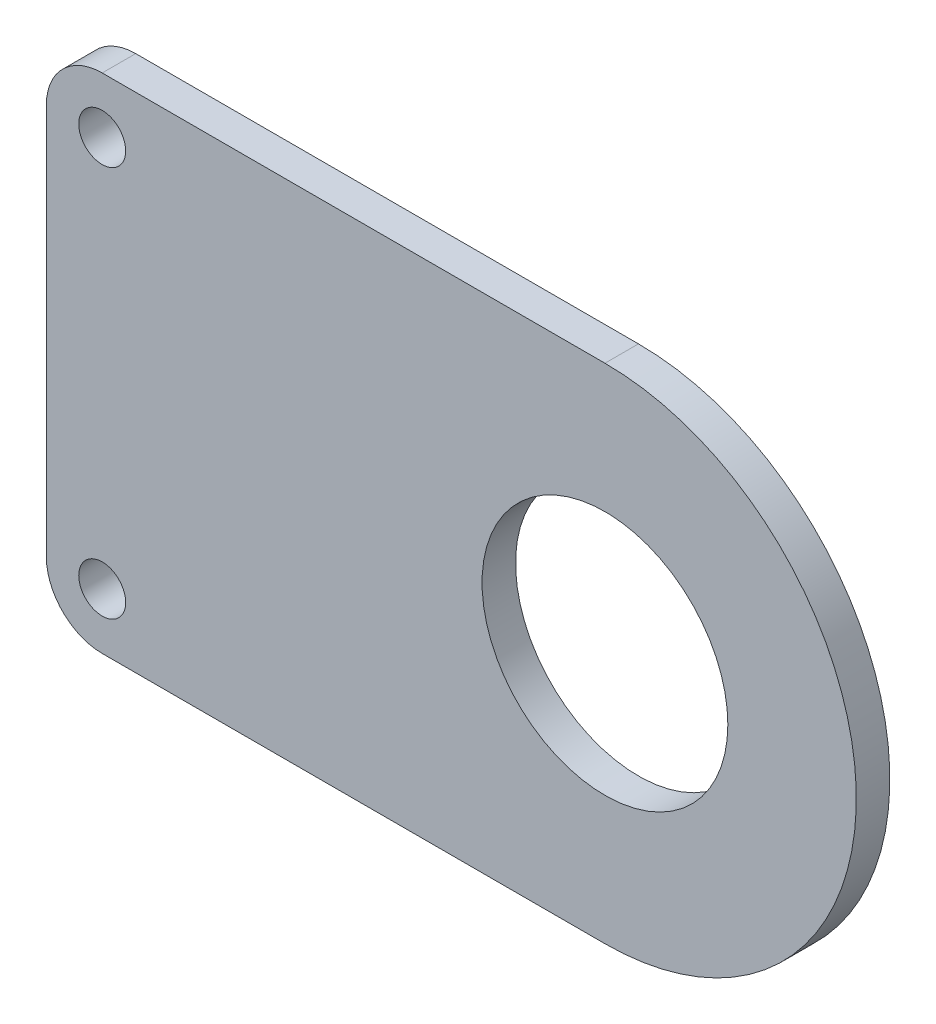
ISO-10303-21;
HEADER;
FILE_DESCRIPTION(('STEP AP214'),'2;1');
FILE_NAME('part.step','',(''),(''),'','','');
FILE_SCHEMA(('AUTOMOTIVE_DESIGN { 1 0 10303 214 1 1 1 1 }'));
ENDSEC;
DATA;
#1=APPLICATION_CONTEXT('core data for automotive mechanical design processes');
#2=APPLICATION_PROTOCOL_DEFINITION('international standard','automotive_design',2000,#1);
#3=PRODUCT_CONTEXT('',#1,'mechanical');
#4=PRODUCT('Part','Part','',(#3));
#5=PRODUCT_RELATED_PRODUCT_CATEGORY('part','',(#4));
#6=PRODUCT_DEFINITION_FORMATION('','',#4);
#7=PRODUCT_DEFINITION_CONTEXT('part definition',#1,'design');
#8=PRODUCT_DEFINITION('design','',#6,#7);
#9=PRODUCT_DEFINITION_SHAPE('','',#8);
#10=(LENGTH_UNIT() NAMED_UNIT(*) SI_UNIT(.MILLI.,.METRE.));
#11=(NAMED_UNIT(*) PLANE_ANGLE_UNIT() SI_UNIT($,.RADIAN.));
#12=(NAMED_UNIT(*) SI_UNIT($,.STERADIAN.) SOLID_ANGLE_UNIT());
#13=UNCERTAINTY_MEASURE_WITH_UNIT(LENGTH_MEASURE(1.E-05),#10,'distance_accuracy_value','');
#14=(GEOMETRIC_REPRESENTATION_CONTEXT(3) GLOBAL_UNCERTAINTY_ASSIGNED_CONTEXT((#13)) GLOBAL_UNIT_ASSIGNED_CONTEXT((#10,
#11,#12)) REPRESENTATION_CONTEXT('',''));
#15=CARTESIAN_POINT('',(0.,0.,0.));
#16=DIRECTION('',(0.,0.,1.));
#17=DIRECTION('',(1.,0.,0.));
#18=AXIS2_PLACEMENT_3D('',#15,#16,#17);
#19=CARTESIAN_POINT('',(0.,0.,3.));
#20=DIRECTION('',(0.,0.,1.));
#21=DIRECTION('',(1.,0.,0.));
#22=AXIS2_PLACEMENT_3D('',#19,#20,#21);
#23=PLANE('',#22);
#24=CARTESIAN_POINT('',(-45.,17.5,3.));
#25=DIRECTION('',(0.,0.,1.));
#26=DIRECTION('',(1.,0.,0.));
#27=AXIS2_PLACEMENT_3D('',#24,#25,#26);
#28=CIRCLE('',#27,2.1);
#29=CARTESIAN_POINT('',(-42.9,17.5,3.));
#30=VERTEX_POINT('',#29);
#31=EDGE_CURVE('E148',#30,#30,#28,.T.);
#32=ORIENTED_EDGE('',*,*,#31,.F.);
#33=EDGE_LOOP('',(#32));
#34=FACE_BOUND('',#33,.T.);
#35=DIRECTION('',(0.,-1.,0.));
#36=VECTOR('',#35,1.);
#37=CARTESIAN_POINT('',(-50.,22.5,3.));
#38=LINE('',#37,#36);
#39=CARTESIAN_POINT('',(-50.,17.5,3.));
#40=VERTEX_POINT('',#39);
#41=CARTESIAN_POINT('',(-50.,-17.5,3.));
#42=VERTEX_POINT('',#41);
#43=EDGE_CURVE('E119',#40,#42,#38,.T.);
#44=ORIENTED_EDGE('',*,*,#43,.T.);
#45=CARTESIAN_POINT('',(-45.,-17.5,3.));
#46=DIRECTION('',(0.,0.,1.));
#47=DIRECTION('',(1.,0.,0.));
#48=AXIS2_PLACEMENT_3D('',#45,#46,#47);
#49=CIRCLE('',#48,5.);
#50=CARTESIAN_POINT('',(-45.,-22.5,3.));
#51=VERTEX_POINT('',#50);
#52=EDGE_CURVE('E45',#42,#51,#49,.T.);
#53=ORIENTED_EDGE('',*,*,#52,.T.);
#54=DIRECTION('',(1.,0.,0.));
#55=VECTOR('',#54,1.);
#56=CARTESIAN_POINT('',(-40.,-22.5,3.));
#57=LINE('',#56,#55);
#58=CARTESIAN_POINT('',(0.,-22.5,3.));
#59=VERTEX_POINT('',#58);
#60=EDGE_CURVE('E91',#51,#59,#57,.T.);
#61=ORIENTED_EDGE('',*,*,#60,.T.);
#62=CARTESIAN_POINT('',(0.,0.,3.));
#63=DIRECTION('',(0.,0.,1.));
#64=DIRECTION('',(1.,0.,0.));
#65=AXIS2_PLACEMENT_3D('',#62,#63,#64);
#66=CIRCLE('',#65,22.5);
#67=CARTESIAN_POINT('',(0.,22.5,3.));
#68=VERTEX_POINT('',#67);
#69=EDGE_CURVE('E94',#59,#68,#66,.T.);
#70=ORIENTED_EDGE('',*,*,#69,.T.);
#71=DIRECTION('',(-1.,0.,0.));
#72=VECTOR('',#71,1.);
#73=CARTESIAN_POINT('',(-40.,22.5,3.));
#74=LINE('',#73,#72);
#75=CARTESIAN_POINT('',(-45.,22.5,3.));
#76=VERTEX_POINT('',#75);
#77=EDGE_CURVE('E110',#68,#76,#74,.T.);
#78=ORIENTED_EDGE('',*,*,#77,.T.);
#79=CARTESIAN_POINT('',(-45.,17.5,3.));
#80=DIRECTION('',(0.,0.,1.));
#81=DIRECTION('',(1.,0.,0.));
#82=AXIS2_PLACEMENT_3D('',#79,#80,#81);
#83=CIRCLE('',#82,5.);
#84=EDGE_CURVE('E130',#76,#40,#83,.T.);
#85=ORIENTED_EDGE('',*,*,#84,.T.);
#86=EDGE_LOOP('',(#44,#53,#61,#70,#78,#85));
#87=FACE_BOUND('',#86,.T.);
#88=CARTESIAN_POINT('',(0.,0.,3.));
#89=DIRECTION('',(0.,0.,1.));
#90=DIRECTION('',(1.,0.,0.));
#91=AXIS2_PLACEMENT_3D('',#88,#89,#90);
#92=CIRCLE('',#91,11.);
#93=CARTESIAN_POINT('',(11.,0.,3.));
#94=VERTEX_POINT('',#93);
#95=EDGE_CURVE('E138',#94,#94,#92,.T.);
#96=ORIENTED_EDGE('',*,*,#95,.F.);
#97=EDGE_LOOP('',(#96));
#98=FACE_BOUND('',#97,.T.);
#99=CARTESIAN_POINT('',(-45.,-17.5,3.));
#100=DIRECTION('',(0.,0.,1.));
#101=DIRECTION('',(-1.,0.,0.));
#102=AXIS2_PLACEMENT_3D('',#99,#100,#101);
#103=CIRCLE('',#102,2.1);
#104=CARTESIAN_POINT('',(-47.1,-17.5,3.));
#105=VERTEX_POINT('',#104);
#106=EDGE_CURVE('E277',#105,#105,#103,.T.);
#107=ORIENTED_EDGE('',*,*,#106,.F.);
#108=EDGE_LOOP('',(#107));
#109=FACE_BOUND('',#108,.T.);
#110=ADVANCED_FACE('F37',(#34,#87,#98,#109),#23,.T.);
#111=CARTESIAN_POINT('',(0.,0.,0.));
#112=DIRECTION('',(0.,0.,1.));
#113=DIRECTION('',(1.,0.,0.));
#114=AXIS2_PLACEMENT_3D('',#111,#112,#113);
#115=PLANE('',#114);
#116=DIRECTION('',(1.,0.,0.));
#117=VECTOR('',#116,1.);
#118=CARTESIAN_POINT('',(-50.,-22.5,0.));
#119=LINE('',#118,#117);
#120=CARTESIAN_POINT('',(-45.,-22.5,0.));
#121=VERTEX_POINT('',#120);
#122=CARTESIAN_POINT('',(0.,-22.5,0.));
#123=VERTEX_POINT('',#122);
#124=EDGE_CURVE('E101',#121,#123,#119,.T.);
#125=ORIENTED_EDGE('',*,*,#124,.F.);
#126=CARTESIAN_POINT('',(-45.,-17.5,0.));
#127=DIRECTION('',(0.,0.,1.));
#128=DIRECTION('',(1.,0.,0.));
#129=AXIS2_PLACEMENT_3D('',#126,#127,#128);
#130=CIRCLE('',#129,5.);
#131=CARTESIAN_POINT('',(-50.,-17.5,0.));
#132=VERTEX_POINT('',#131);
#133=EDGE_CURVE('E124',#121,#132,#130,.F.);
#134=ORIENTED_EDGE('',*,*,#133,.T.);
#135=DIRECTION('',(0.,-1.,0.));
#136=VECTOR('',#135,1.);
#137=CARTESIAN_POINT('',(-50.,22.5,0.));
#138=LINE('',#137,#136);
#139=CARTESIAN_POINT('',(-50.,17.5,0.));
#140=VERTEX_POINT('',#139);
#141=EDGE_CURVE('E162',#140,#132,#138,.T.);
#142=ORIENTED_EDGE('',*,*,#141,.F.);
#143=CARTESIAN_POINT('',(-45.,17.5,0.));
#144=DIRECTION('',(0.,0.,1.));
#145=DIRECTION('',(1.,0.,0.));
#146=AXIS2_PLACEMENT_3D('',#143,#144,#145);
#147=CIRCLE('',#146,5.);
#148=CARTESIAN_POINT('',(-45.,22.5,0.));
#149=VERTEX_POINT('',#148);
#150=EDGE_CURVE('E117',#140,#149,#147,.F.);
#151=ORIENTED_EDGE('',*,*,#150,.T.);
#152=DIRECTION('',(-1.,0.,0.));
#153=VECTOR('',#152,1.);
#154=CARTESIAN_POINT('',(-50.,22.5,0.));
#155=LINE('',#154,#153);
#156=CARTESIAN_POINT('',(0.,22.5,0.));
#157=VERTEX_POINT('',#156);
#158=EDGE_CURVE('E160',#157,#149,#155,.T.);
#159=ORIENTED_EDGE('',*,*,#158,.F.);
#160=CARTESIAN_POINT('',(0.,0.,0.));
#161=DIRECTION('',(0.,0.,1.));
#162=DIRECTION('',(1.,0.,0.));
#163=AXIS2_PLACEMENT_3D('',#160,#161,#162);
#164=CIRCLE('',#163,22.5);
#165=EDGE_CURVE('E143',#123,#157,#164,.T.);
#166=ORIENTED_EDGE('',*,*,#165,.F.);
#167=EDGE_LOOP('',(#125,#134,#142,#151,#159,#166));
#168=FACE_BOUND('',#167,.T.);
#169=CARTESIAN_POINT('',(0.,0.,0.));
#170=DIRECTION('',(0.,0.,1.));
#171=DIRECTION('',(1.,0.,0.));
#172=AXIS2_PLACEMENT_3D('',#169,#170,#171);
#173=CIRCLE('',#172,11.);
#174=CARTESIAN_POINT('',(11.,0.,0.));
#175=VERTEX_POINT('',#174);
#176=EDGE_CURVE('E144',#175,#175,#173,.T.);
#177=ORIENTED_EDGE('',*,*,#176,.T.);
#178=EDGE_LOOP('',(#177));
#179=FACE_BOUND('',#178,.T.);
#180=CARTESIAN_POINT('',(-45.,17.5,0.));
#181=DIRECTION('',(0.,0.,1.));
#182=DIRECTION('',(1.,0.,0.));
#183=AXIS2_PLACEMENT_3D('',#180,#181,#182);
#184=CIRCLE('',#183,2.1);
#185=CARTESIAN_POINT('',(-42.9,17.5,0.));
#186=VERTEX_POINT('',#185);
#187=EDGE_CURVE('E145',#186,#186,#184,.T.);
#188=ORIENTED_EDGE('',*,*,#187,.T.);
#189=EDGE_LOOP('',(#188));
#190=FACE_BOUND('',#189,.T.);
#191=CARTESIAN_POINT('',(-45.,-17.5,0.));
#192=DIRECTION('',(0.,0.,1.));
#193=DIRECTION('',(-1.,0.,0.));
#194=AXIS2_PLACEMENT_3D('',#191,#192,#193);
#195=CIRCLE('',#194,2.1);
#196=CARTESIAN_POINT('',(-47.1,-17.5,0.));
#197=VERTEX_POINT('',#196);
#198=EDGE_CURVE('E280',#197,#197,#195,.T.);
#199=ORIENTED_EDGE('',*,*,#198,.T.);
#200=EDGE_LOOP('',(#199));
#201=FACE_BOUND('',#200,.T.);
#202=ADVANCED_FACE('F169',(#168,#179,#190,#201),#115,.F.);
#203=CARTESIAN_POINT('',(0.,0.,3.));
#204=DIRECTION('',(0.,0.,-1.));
#205=DIRECTION('',(-1.,0.,0.));
#206=AXIS2_PLACEMENT_3D('',#203,#204,#205);
#207=CYLINDRICAL_SURFACE('',#206,22.5);
#208=ORIENTED_EDGE('',*,*,#165,.T.);
#209=DIRECTION('',(0.,0.,-1.));
#210=VECTOR('',#209,1.);
#211=CARTESIAN_POINT('',(0.,22.5,3.));
#212=LINE('',#211,#210);
#213=EDGE_CURVE('E109',#68,#157,#212,.T.);
#214=ORIENTED_EDGE('',*,*,#213,.F.);
#215=ORIENTED_EDGE('',*,*,#69,.F.);
#216=DIRECTION('',(0.,0.,-1.));
#217=VECTOR('',#216,1.);
#218=CARTESIAN_POINT('',(0.,-22.5,3.));
#219=LINE('',#218,#217);
#220=EDGE_CURVE('E107',#59,#123,#219,.T.);
#221=ORIENTED_EDGE('',*,*,#220,.T.);
#222=EDGE_LOOP('',(#208,#214,#215,#221));
#223=FACE_BOUND('',#222,.T.);
#224=ADVANCED_FACE('F106',(#223),#207,.T.);
#225=CARTESIAN_POINT('',(-50.,22.5,3.));
#226=DIRECTION('',(0.,-1.,0.));
#227=DIRECTION('',(0.,0.,-1.));
#228=AXIS2_PLACEMENT_3D('',#225,#226,#227);
#229=PLANE('',#228);
#230=ORIENTED_EDGE('',*,*,#158,.T.);
#231=DIRECTION('',(0.,0.,-1.));
#232=VECTOR('',#231,1.);
#233=CARTESIAN_POINT('',(-45.,22.5,3.));
#234=LINE('',#233,#232);
#235=EDGE_CURVE('E12',#149,#76,#234,.F.);
#236=ORIENTED_EDGE('',*,*,#235,.T.);
#237=ORIENTED_EDGE('',*,*,#77,.F.);
#238=ORIENTED_EDGE('',*,*,#213,.T.);
#239=EDGE_LOOP('',(#230,#236,#237,#238));
#240=FACE_BOUND('',#239,.T.);
#241=ADVANCED_FACE('F171',(#240),#229,.F.);
#242=CARTESIAN_POINT('',(-50.,22.5,3.));
#243=DIRECTION('',(1.,0.,0.));
#244=DIRECTION('',(0.,1.,0.));
#245=AXIS2_PLACEMENT_3D('',#242,#243,#244);
#246=PLANE('',#245);
#247=ORIENTED_EDGE('',*,*,#141,.T.);
#248=DIRECTION('',(0.,0.,-1.));
#249=VECTOR('',#248,1.);
#250=CARTESIAN_POINT('',(-50.,-17.5,3.));
#251=LINE('',#250,#249);
#252=EDGE_CURVE('E58',#132,#42,#251,.F.);
#253=ORIENTED_EDGE('',*,*,#252,.T.);
#254=ORIENTED_EDGE('',*,*,#43,.F.);
#255=DIRECTION('',(0.,0.,-1.));
#256=VECTOR('',#255,1.);
#257=CARTESIAN_POINT('',(-50.,17.5,3.));
#258=LINE('',#257,#256);
#259=EDGE_CURVE('E126',#40,#140,#258,.T.);
#260=ORIENTED_EDGE('',*,*,#259,.T.);
#261=EDGE_LOOP('',(#247,#253,#254,#260));
#262=FACE_BOUND('',#261,.T.);
#263=ADVANCED_FACE('F164',(#262),#246,.F.);
#264=CARTESIAN_POINT('',(-50.,-22.5,3.));
#265=DIRECTION('',(0.,1.,0.));
#266=DIRECTION('',(-1.,0.,0.));
#267=AXIS2_PLACEMENT_3D('',#264,#265,#266);
#268=PLANE('',#267);
#269=ORIENTED_EDGE('',*,*,#60,.F.);
#270=DIRECTION('',(0.,0.,-1.));
#271=VECTOR('',#270,1.);
#272=CARTESIAN_POINT('',(-45.,-22.5,3.));
#273=LINE('',#272,#271);
#274=EDGE_CURVE('E115',#51,#121,#273,.T.);
#275=ORIENTED_EDGE('',*,*,#274,.T.);
#276=ORIENTED_EDGE('',*,*,#124,.T.);
#277=ORIENTED_EDGE('',*,*,#220,.F.);
#278=EDGE_LOOP('',(#269,#275,#276,#277));
#279=FACE_BOUND('',#278,.T.);
#280=ADVANCED_FACE('F112',(#279),#268,.F.);
#281=CARTESIAN_POINT('',(0.,0.,3.));
#282=DIRECTION('',(0.,0.,-1.));
#283=DIRECTION('',(-1.,0.,0.));
#284=AXIS2_PLACEMENT_3D('',#281,#282,#283);
#285=CYLINDRICAL_SURFACE('',#284,11.);
#286=ORIENTED_EDGE('',*,*,#95,.T.);
#287=EDGE_LOOP('',(#286));
#288=FACE_BOUND('',#287,.T.);
#289=ORIENTED_EDGE('',*,*,#176,.F.);
#290=EDGE_LOOP('',(#289));
#291=FACE_BOUND('',#290,.T.);
#292=ADVANCED_FACE('F188',(#288,#291),#285,.F.);
#293=CARTESIAN_POINT('',(-45.,17.5,3.));
#294=DIRECTION('',(0.,0.,-1.));
#295=DIRECTION('',(-1.,0.,0.));
#296=AXIS2_PLACEMENT_3D('',#293,#294,#295);
#297=CYLINDRICAL_SURFACE('',#296,2.1);
#298=ORIENTED_EDGE('',*,*,#31,.T.);
#299=EDGE_LOOP('',(#298));
#300=FACE_BOUND('',#299,.T.);
#301=ORIENTED_EDGE('',*,*,#187,.F.);
#302=EDGE_LOOP('',(#301));
#303=FACE_BOUND('',#302,.T.);
#304=ADVANCED_FACE('F221',(#300,#303),#297,.F.);
#305=CARTESIAN_POINT('',(-45.,-17.5,3.));
#306=DIRECTION('',(0.,0.,-1.));
#307=DIRECTION('',(-1.,0.,0.));
#308=AXIS2_PLACEMENT_3D('',#305,#306,#307);
#309=CYLINDRICAL_SURFACE('',#308,2.1);
#310=ORIENTED_EDGE('',*,*,#106,.T.);
#311=EDGE_LOOP('',(#310));
#312=FACE_BOUND('',#311,.T.);
#313=ORIENTED_EDGE('',*,*,#198,.F.);
#314=EDGE_LOOP('',(#313));
#315=FACE_BOUND('',#314,.T.);
#316=ADVANCED_FACE('F178',(#312,#315),#309,.F.);
#317=CARTESIAN_POINT('',(-45.,-17.5,3.));
#318=DIRECTION('',(0.,0.,-1.));
#319=DIRECTION('',(-1.,0.,0.));
#320=AXIS2_PLACEMENT_3D('',#317,#318,#319);
#321=CYLINDRICAL_SURFACE('',#320,5.);
#322=ORIENTED_EDGE('',*,*,#52,.F.);
#323=ORIENTED_EDGE('',*,*,#252,.F.);
#324=ORIENTED_EDGE('',*,*,#133,.F.);
#325=ORIENTED_EDGE('',*,*,#274,.F.);
#326=EDGE_LOOP('',(#322,#323,#324,#325));
#327=FACE_BOUND('',#326,.T.);
#328=ADVANCED_FACE('F168',(#327),#321,.T.);
#329=CARTESIAN_POINT('',(-45.,17.5,3.));
#330=DIRECTION('',(0.,0.,-1.));
#331=DIRECTION('',(-1.,0.,0.));
#332=AXIS2_PLACEMENT_3D('',#329,#330,#331);
#333=CYLINDRICAL_SURFACE('',#332,5.);
#334=ORIENTED_EDGE('',*,*,#84,.F.);
#335=ORIENTED_EDGE('',*,*,#235,.F.);
#336=ORIENTED_EDGE('',*,*,#150,.F.);
#337=ORIENTED_EDGE('',*,*,#259,.F.);
#338=EDGE_LOOP('',(#334,#335,#336,#337));
#339=FACE_BOUND('',#338,.T.);
#340=ADVANCED_FACE('F39',(#339),#333,.T.);
#341=CLOSED_SHELL('',(#110,#202,#224,#241,#263,#280,#292,#304,#316,#328,#340));
#342=MANIFOLD_SOLID_BREP('B2',#341);
#343=ADVANCED_BREP_SHAPE_REPRESENTATION('',(#18,#342),#14);
#344=SHAPE_DEFINITION_REPRESENTATION(#9,#343);
ENDSEC;
END-ISO-10303-21;
